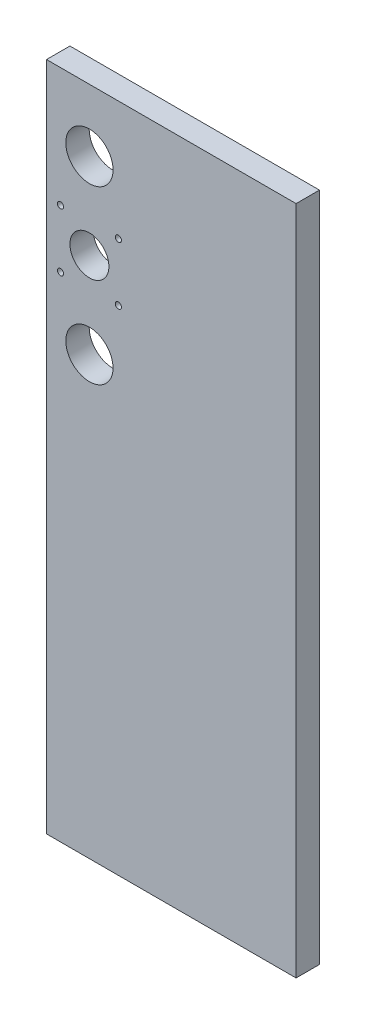
ISO-10303-21;
HEADER;
FILE_DESCRIPTION(('STEP AP214'),'2;1');
FILE_NAME('part.step','',(''),(''),'','','');
FILE_SCHEMA(('AUTOMOTIVE_DESIGN { 1 0 10303 214 1 1 1 1 }'));
ENDSEC;
DATA;
#1=APPLICATION_CONTEXT('core data for automotive mechanical design processes');
#2=APPLICATION_PROTOCOL_DEFINITION('international standard','automotive_design',2000,#1);
#3=PRODUCT_CONTEXT('',#1,'mechanical');
#4=PRODUCT('Part','Part','',(#3));
#5=PRODUCT_RELATED_PRODUCT_CATEGORY('part','',(#4));
#6=PRODUCT_DEFINITION_FORMATION('','',#4);
#7=PRODUCT_DEFINITION_CONTEXT('part definition',#1,'design');
#8=PRODUCT_DEFINITION('design','',#6,#7);
#9=PRODUCT_DEFINITION_SHAPE('','',#8);
#10=(LENGTH_UNIT() NAMED_UNIT(*) SI_UNIT(.MILLI.,.METRE.));
#11=(NAMED_UNIT(*) PLANE_ANGLE_UNIT() SI_UNIT($,.RADIAN.));
#12=(NAMED_UNIT(*) SI_UNIT($,.STERADIAN.) SOLID_ANGLE_UNIT());
#13=UNCERTAINTY_MEASURE_WITH_UNIT(LENGTH_MEASURE(1.E-05),#10,'distance_accuracy_value','');
#14=(GEOMETRIC_REPRESENTATION_CONTEXT(3) GLOBAL_UNCERTAINTY_ASSIGNED_CONTEXT((#13)) GLOBAL_UNIT_ASSIGNED_CONTEXT((#10,
#11,#12)) REPRESENTATION_CONTEXT('',''));
#15=CARTESIAN_POINT('',(0.,0.,0.));
#16=DIRECTION('',(0.,0.,1.));
#17=DIRECTION('',(1.,0.,0.));
#18=AXIS2_PLACEMENT_3D('',#15,#16,#17);
#19=CARTESIAN_POINT('',(0.,0.,19.05));
#20=DIRECTION('',(1.,0.,0.));
#21=DIRECTION('',(0.,0.,-1.));
#22=AXIS2_PLACEMENT_3D('',#19,#20,#21);
#23=PLANE('',#22);
#24=DIRECTION('',(0.,-1.,0.));
#25=VECTOR('',#24,1.);
#26=CARTESIAN_POINT('',(0.,0.,0.));
#27=LINE('',#26,#25);
#28=CARTESIAN_POINT('',(0.,546.1,0.));
#29=VERTEX_POINT('',#28);
#30=CARTESIAN_POINT('',(0.,0.,0.));
#31=VERTEX_POINT('',#30);
#32=EDGE_CURVE('E95',#29,#31,#27,.T.);
#33=ORIENTED_EDGE('',*,*,#32,.T.);
#34=DIRECTION('',(0.,0.,-1.));
#35=VECTOR('',#34,1.);
#36=CARTESIAN_POINT('',(0.,0.,19.05));
#37=LINE('',#36,#35);
#38=CARTESIAN_POINT('',(0.,0.,19.05));
#39=VERTEX_POINT('',#38);
#40=EDGE_CURVE('E11',#39,#31,#37,.T.);
#41=ORIENTED_EDGE('',*,*,#40,.F.);
#42=DIRECTION('',(0.,-1.,0.));
#43=VECTOR('',#42,1.);
#44=CARTESIAN_POINT('',(0.,0.,19.05));
#45=LINE('',#44,#43);
#46=CARTESIAN_POINT('',(0.,546.1,19.05));
#47=VERTEX_POINT('',#46);
#48=EDGE_CURVE('E83',#47,#39,#45,.T.);
#49=ORIENTED_EDGE('',*,*,#48,.F.);
#50=DIRECTION('',(0.,0.,-1.));
#51=VECTOR('',#50,1.);
#52=CARTESIAN_POINT('',(0.,546.1,19.05));
#53=LINE('',#52,#51);
#54=EDGE_CURVE('E91',#47,#29,#53,.T.);
#55=ORIENTED_EDGE('',*,*,#54,.T.);
#56=EDGE_LOOP('',(#33,#41,#49,#55));
#57=FACE_BOUND('',#56,.T.);
#58=ADVANCED_FACE('F32',(#57),#23,.F.);
#59=CARTESIAN_POINT('',(0.,0.,19.05));
#60=DIRECTION('',(0.,1.,0.));
#61=DIRECTION('',(0.,0.,1.));
#62=AXIS2_PLACEMENT_3D('',#59,#60,#61);
#63=PLANE('',#62);
#64=DIRECTION('',(1.,0.,0.));
#65=VECTOR('',#64,1.);
#66=CARTESIAN_POINT('',(0.,0.,0.));
#67=LINE('',#66,#65);
#68=CARTESIAN_POINT('',(203.2,0.,0.));
#69=VERTEX_POINT('',#68);
#70=EDGE_CURVE('E87',#31,#69,#67,.T.);
#71=ORIENTED_EDGE('',*,*,#70,.T.);
#72=DIRECTION('',(0.,0.,-1.));
#73=VECTOR('',#72,1.);
#74=CARTESIAN_POINT('',(203.2,0.,19.05));
#75=LINE('',#74,#73);
#76=CARTESIAN_POINT('',(203.2,0.,19.05));
#77=VERTEX_POINT('',#76);
#78=EDGE_CURVE('E40',#77,#69,#75,.T.);
#79=ORIENTED_EDGE('',*,*,#78,.F.);
#80=DIRECTION('',(1.,0.,0.));
#81=VECTOR('',#80,1.);
#82=CARTESIAN_POINT('',(0.,0.,19.05));
#83=LINE('',#82,#81);
#84=EDGE_CURVE('E78',#39,#77,#83,.T.);
#85=ORIENTED_EDGE('',*,*,#84,.F.);
#86=ORIENTED_EDGE('',*,*,#40,.T.);
#87=EDGE_LOOP('',(#71,#79,#85,#86));
#88=FACE_BOUND('',#87,.T.);
#89=ADVANCED_FACE('F86',(#88),#63,.F.);
#90=CARTESIAN_POINT('',(203.2,0.,19.05));
#91=DIRECTION('',(-1.,0.,0.));
#92=DIRECTION('',(0.,0.,1.));
#93=AXIS2_PLACEMENT_3D('',#90,#91,#92);
#94=PLANE('',#93);
#95=DIRECTION('',(0.,1.,0.));
#96=VECTOR('',#95,1.);
#97=CARTESIAN_POINT('',(203.2,0.,0.));
#98=LINE('',#97,#96);
#99=CARTESIAN_POINT('',(203.2,546.1,0.));
#100=VERTEX_POINT('',#99);
#101=EDGE_CURVE('E65',#69,#100,#98,.T.);
#102=ORIENTED_EDGE('',*,*,#101,.T.);
#103=DIRECTION('',(0.,0.,-1.));
#104=VECTOR('',#103,1.);
#105=CARTESIAN_POINT('',(203.2,546.1,19.05));
#106=LINE('',#105,#104);
#107=CARTESIAN_POINT('',(203.2,546.1,19.05));
#108=VERTEX_POINT('',#107);
#109=EDGE_CURVE('E88',#108,#100,#106,.T.);
#110=ORIENTED_EDGE('',*,*,#109,.F.);
#111=DIRECTION('',(0.,1.,0.));
#112=VECTOR('',#111,1.);
#113=CARTESIAN_POINT('',(203.2,0.,19.05));
#114=LINE('',#113,#112);
#115=EDGE_CURVE('E81',#77,#108,#114,.T.);
#116=ORIENTED_EDGE('',*,*,#115,.F.);
#117=ORIENTED_EDGE('',*,*,#78,.T.);
#118=EDGE_LOOP('',(#102,#110,#116,#117));
#119=FACE_BOUND('',#118,.T.);
#120=ADVANCED_FACE('F89',(#119),#94,.F.);
#121=CARTESIAN_POINT('',(0.,546.1,19.05));
#122=DIRECTION('',(0.,-1.,0.));
#123=DIRECTION('',(0.,0.,-1.));
#124=AXIS2_PLACEMENT_3D('',#121,#122,#123);
#125=PLANE('',#124);
#126=DIRECTION('',(-1.,0.,0.));
#127=VECTOR('',#126,1.);
#128=CARTESIAN_POINT('',(0.,546.1,0.));
#129=LINE('',#128,#127);
#130=EDGE_CURVE('E71',#100,#29,#129,.T.);
#131=ORIENTED_EDGE('',*,*,#130,.T.);
#132=ORIENTED_EDGE('',*,*,#54,.F.);
#133=DIRECTION('',(-1.,0.,0.));
#134=VECTOR('',#133,1.);
#135=CARTESIAN_POINT('',(0.,546.1,19.05));
#136=LINE('',#135,#134);
#137=EDGE_CURVE('E48',#108,#47,#136,.T.);
#138=ORIENTED_EDGE('',*,*,#137,.F.);
#139=ORIENTED_EDGE('',*,*,#109,.T.);
#140=EDGE_LOOP('',(#131,#132,#138,#139));
#141=FACE_BOUND('',#140,.T.);
#142=ADVANCED_FACE('F103',(#141),#125,.F.);
#143=CARTESIAN_POINT('',(0.,546.1,19.05));
#144=DIRECTION('',(0.,0.,-1.));
#145=DIRECTION('',(-1.,0.,0.));
#146=AXIS2_PLACEMENT_3D('',#143,#144,#145);
#147=PLANE('',#146);
#148=CARTESIAN_POINT('',(58.4962,401.8788,19.05));
#149=DIRECTION('',(0.,0.,-1.));
#150=DIRECTION('',(-1.,0.,0.));
#151=AXIS2_PLACEMENT_3D('',#148,#149,#150);
#152=CIRCLE('',#151,2.5);
#153=CARTESIAN_POINT('',(55.9962,401.8788,19.05));
#154=VERTEX_POINT('',#153);
#155=EDGE_CURVE('E144',#154,#154,#152,.F.);
#156=ORIENTED_EDGE('',*,*,#155,.F.);
#157=EDGE_LOOP('',(#156));
#158=FACE_BOUND('',#157,.T.);
#159=CARTESIAN_POINT('',(11.3538,401.8788,19.05));
#160=DIRECTION('',(0.,0.,-1.));
#161=DIRECTION('',(-1.,0.,0.));
#162=AXIS2_PLACEMENT_3D('',#159,#160,#161);
#163=CIRCLE('',#162,2.5);
#164=CARTESIAN_POINT('',(8.8538,401.8788,19.05));
#165=VERTEX_POINT('',#164);
#166=EDGE_CURVE('E138',#165,#165,#163,.F.);
#167=ORIENTED_EDGE('',*,*,#166,.F.);
#168=EDGE_LOOP('',(#167));
#169=FACE_BOUND('',#168,.T.);
#170=CARTESIAN_POINT('',(11.3538,449.0212,19.05));
#171=DIRECTION('',(0.,0.,-1.));
#172=DIRECTION('',(-1.,0.,0.));
#173=AXIS2_PLACEMENT_3D('',#170,#171,#172);
#174=CIRCLE('',#173,2.5);
#175=CARTESIAN_POINT('',(8.8538,449.0212,19.05));
#176=VERTEX_POINT('',#175);
#177=EDGE_CURVE('E132',#176,#176,#174,.F.);
#178=ORIENTED_EDGE('',*,*,#177,.F.);
#179=EDGE_LOOP('',(#178));
#180=FACE_BOUND('',#179,.T.);
#181=CARTESIAN_POINT('',(58.4962,449.0212,19.05));
#182=DIRECTION('',(0.,0.,-1.));
#183=DIRECTION('',(-1.,0.,0.));
#184=AXIS2_PLACEMENT_3D('',#181,#182,#183);
#185=CIRCLE('',#184,2.5);
#186=CARTESIAN_POINT('',(55.9962,449.0212,19.05));
#187=VERTEX_POINT('',#186);
#188=EDGE_CURVE('E126',#187,#187,#185,.F.);
#189=ORIENTED_EDGE('',*,*,#188,.F.);
#190=EDGE_LOOP('',(#189));
#191=FACE_BOUND('',#190,.T.);
#192=CARTESIAN_POINT('',(34.925,425.45,19.05));
#193=DIRECTION('',(0.,0.,-1.));
#194=DIRECTION('',(-1.,0.,0.));
#195=AXIS2_PLACEMENT_3D('',#192,#193,#194);
#196=CIRCLE('',#195,15.875);
#197=CARTESIAN_POINT('',(19.05,425.45,19.05));
#198=VERTEX_POINT('',#197);
#199=EDGE_CURVE('E118',#198,#198,#196,.F.);
#200=ORIENTED_EDGE('',*,*,#199,.F.);
#201=EDGE_LOOP('',(#200));
#202=FACE_BOUND('',#201,.T.);
#203=CARTESIAN_POINT('',(34.9250000000001,355.6,19.05));
#204=DIRECTION('',(0.,0.,-1.));
#205=DIRECTION('',(-1.,0.,0.));
#206=AXIS2_PLACEMENT_3D('',#203,#204,#205);
#207=CIRCLE('',#206,19.2405);
#208=CARTESIAN_POINT('',(15.6845,355.6,19.05));
#209=VERTEX_POINT('',#208);
#210=EDGE_CURVE('E112',#209,#209,#207,.T.);
#211=ORIENTED_EDGE('',*,*,#210,.T.);
#212=EDGE_LOOP('',(#211));
#213=FACE_BOUND('',#212,.T.);
#214=CARTESIAN_POINT('',(34.9250000000001,495.3,19.05));
#215=DIRECTION('',(0.,0.,-1.));
#216=DIRECTION('',(-1.,0.,0.));
#217=AXIS2_PLACEMENT_3D('',#214,#215,#216);
#218=CIRCLE('',#217,19.2405);
#219=CARTESIAN_POINT('',(15.6845,495.3,19.05));
#220=VERTEX_POINT('',#219);
#221=EDGE_CURVE('E98',#220,#220,#218,.T.);
#222=ORIENTED_EDGE('',*,*,#221,.T.);
#223=EDGE_LOOP('',(#222));
#224=FACE_BOUND('',#223,.T.);
#225=ORIENTED_EDGE('',*,*,#48,.T.);
#226=ORIENTED_EDGE('',*,*,#84,.T.);
#227=ORIENTED_EDGE('',*,*,#115,.T.);
#228=ORIENTED_EDGE('',*,*,#137,.T.);
#229=EDGE_LOOP('',(#225,#226,#227,#228));
#230=FACE_BOUND('',#229,.T.);
#231=ADVANCED_FACE('F79',(#158,#169,#180,#191,#202,#213,#224,#230),#147,.F.);
#232=CARTESIAN_POINT('',(0.,546.1,0.));
#233=DIRECTION('',(0.,0.,-1.));
#234=DIRECTION('',(-1.,0.,0.));
#235=AXIS2_PLACEMENT_3D('',#232,#233,#234);
#236=PLANE('',#235);
#237=CARTESIAN_POINT('',(58.4962,401.8788,0.));
#238=DIRECTION('',(0.,0.,-1.));
#239=DIRECTION('',(-1.,0.,0.));
#240=AXIS2_PLACEMENT_3D('',#237,#238,#239);
#241=CIRCLE('',#240,2.5);
#242=CARTESIAN_POINT('',(55.9962,401.8788,0.));
#243=VERTEX_POINT('',#242);
#244=EDGE_CURVE('E147',#243,#243,#241,.T.);
#245=ORIENTED_EDGE('',*,*,#244,.F.);
#246=EDGE_LOOP('',(#245));
#247=FACE_BOUND('',#246,.T.);
#248=CARTESIAN_POINT('',(11.3538,401.8788,0.));
#249=DIRECTION('',(0.,0.,-1.));
#250=DIRECTION('',(-1.,0.,0.));
#251=AXIS2_PLACEMENT_3D('',#248,#249,#250);
#252=CIRCLE('',#251,2.5);
#253=CARTESIAN_POINT('',(8.8538,401.8788,0.));
#254=VERTEX_POINT('',#253);
#255=EDGE_CURVE('E141',#254,#254,#252,.T.);
#256=ORIENTED_EDGE('',*,*,#255,.F.);
#257=EDGE_LOOP('',(#256));
#258=FACE_BOUND('',#257,.T.);
#259=CARTESIAN_POINT('',(11.3538,449.0212,0.));
#260=DIRECTION('',(0.,0.,-1.));
#261=DIRECTION('',(-1.,0.,0.));
#262=AXIS2_PLACEMENT_3D('',#259,#260,#261);
#263=CIRCLE('',#262,2.5);
#264=CARTESIAN_POINT('',(8.8538,449.0212,0.));
#265=VERTEX_POINT('',#264);
#266=EDGE_CURVE('E135',#265,#265,#263,.T.);
#267=ORIENTED_EDGE('',*,*,#266,.F.);
#268=EDGE_LOOP('',(#267));
#269=FACE_BOUND('',#268,.T.);
#270=CARTESIAN_POINT('',(58.4962,449.0212,0.));
#271=DIRECTION('',(0.,0.,-1.));
#272=DIRECTION('',(-1.,0.,0.));
#273=AXIS2_PLACEMENT_3D('',#270,#271,#272);
#274=CIRCLE('',#273,2.5);
#275=CARTESIAN_POINT('',(55.9962,449.0212,0.));
#276=VERTEX_POINT('',#275);
#277=EDGE_CURVE('E129',#276,#276,#274,.T.);
#278=ORIENTED_EDGE('',*,*,#277,.F.);
#279=EDGE_LOOP('',(#278));
#280=FACE_BOUND('',#279,.T.);
#281=CARTESIAN_POINT('',(34.925,425.45,0.));
#282=DIRECTION('',(0.,0.,-1.));
#283=DIRECTION('',(-1.,0.,0.));
#284=AXIS2_PLACEMENT_3D('',#281,#282,#283);
#285=CIRCLE('',#284,15.875);
#286=CARTESIAN_POINT('',(19.05,425.45,0.));
#287=VERTEX_POINT('',#286);
#288=EDGE_CURVE('E123',#287,#287,#285,.T.);
#289=ORIENTED_EDGE('',*,*,#288,.F.);
#290=EDGE_LOOP('',(#289));
#291=FACE_BOUND('',#290,.T.);
#292=CARTESIAN_POINT('',(34.9250000000001,355.6,0.));
#293=DIRECTION('',(0.,0.,-1.));
#294=DIRECTION('',(-1.,0.,0.));
#295=AXIS2_PLACEMENT_3D('',#292,#293,#294);
#296=CIRCLE('',#295,19.2405);
#297=CARTESIAN_POINT('',(15.6845,355.6,0.));
#298=VERTEX_POINT('',#297);
#299=EDGE_CURVE('E115',#298,#298,#296,.T.);
#300=ORIENTED_EDGE('',*,*,#299,.F.);
#301=EDGE_LOOP('',(#300));
#302=FACE_BOUND('',#301,.T.);
#303=CARTESIAN_POINT('',(34.9250000000001,495.3,0.));
#304=DIRECTION('',(0.,0.,-1.));
#305=DIRECTION('',(-1.,0.,0.));
#306=AXIS2_PLACEMENT_3D('',#303,#304,#305);
#307=CIRCLE('',#306,19.2405);
#308=CARTESIAN_POINT('',(15.6845,495.3,0.));
#309=VERTEX_POINT('',#308);
#310=EDGE_CURVE('E109',#309,#309,#307,.T.);
#311=ORIENTED_EDGE('',*,*,#310,.F.);
#312=EDGE_LOOP('',(#311));
#313=FACE_BOUND('',#312,.T.);
#314=ORIENTED_EDGE('',*,*,#32,.F.);
#315=ORIENTED_EDGE('',*,*,#130,.F.);
#316=ORIENTED_EDGE('',*,*,#101,.F.);
#317=ORIENTED_EDGE('',*,*,#70,.F.);
#318=EDGE_LOOP('',(#314,#315,#316,#317));
#319=FACE_BOUND('',#318,.T.);
#320=ADVANCED_FACE('F106',(#247,#258,#269,#280,#291,#302,#313,#319),#236,.T.);
#321=CARTESIAN_POINT('',(34.9250000000001,495.3,19.05));
#322=DIRECTION('',(0.,0.,-1.));
#323=DIRECTION('',(-1.,0.,0.));
#324=AXIS2_PLACEMENT_3D('',#321,#322,#323);
#325=CYLINDRICAL_SURFACE('',#324,19.2405);
#326=CARTESIAN_POINT('',(15.6845,495.3,19.05));
#327=CARTESIAN_POINT('',(15.6845,495.3,18.8515625));
#328=CARTESIAN_POINT('',(15.6845,495.3,18.653125));
#329=CARTESIAN_POINT('',(15.6845,495.3,18.25625));
#330=CARTESIAN_POINT('',(15.6845,495.3,18.0578125));
#331=CARTESIAN_POINT('',(15.6845,495.3,17.6609375));
#332=CARTESIAN_POINT('',(15.6845,495.3,17.4625));
#333=CARTESIAN_POINT('',(15.6845,495.3,17.065625));
#334=CARTESIAN_POINT('',(15.6845,495.3,16.8671875));
#335=CARTESIAN_POINT('',(15.6845,495.3,16.4703125));
#336=CARTESIAN_POINT('',(15.6845,495.3,16.271875));
#337=CARTESIAN_POINT('',(15.6845,495.3,15.875));
#338=CARTESIAN_POINT('',(15.6845,495.3,15.6765625));
#339=CARTESIAN_POINT('',(15.6845,495.3,15.2796875));
#340=CARTESIAN_POINT('',(15.6845,495.3,15.08125));
#341=CARTESIAN_POINT('',(15.6845,495.3,14.684375));
#342=CARTESIAN_POINT('',(15.6845,495.3,14.4859375));
#343=CARTESIAN_POINT('',(15.6845,495.3,14.0890625));
#344=CARTESIAN_POINT('',(15.6845,495.3,13.890625));
#345=CARTESIAN_POINT('',(15.6845,495.3,13.49375));
#346=CARTESIAN_POINT('',(15.6845,495.3,13.2953125));
#347=CARTESIAN_POINT('',(15.6845,495.3,12.8984375));
#348=CARTESIAN_POINT('',(15.6845,495.3,12.7));
#349=CARTESIAN_POINT('',(15.6845,495.3,12.303125));
#350=CARTESIAN_POINT('',(15.6845,495.3,12.1046875));
#351=CARTESIAN_POINT('',(15.6845,495.3,11.7078125));
#352=CARTESIAN_POINT('',(15.6845,495.3,11.509375));
#353=CARTESIAN_POINT('',(15.6845,495.3,11.1125));
#354=CARTESIAN_POINT('',(15.6845,495.3,10.9140625));
#355=CARTESIAN_POINT('',(15.6845,495.3,10.5171875));
#356=CARTESIAN_POINT('',(15.6845,495.3,10.31875));
#357=CARTESIAN_POINT('',(15.6845,495.3,9.921875));
#358=CARTESIAN_POINT('',(15.6845,495.3,9.7234375));
#359=CARTESIAN_POINT('',(15.6845,495.3,9.3265625));
#360=CARTESIAN_POINT('',(15.6845,495.3,9.128125));
#361=CARTESIAN_POINT('',(15.6845,495.3,8.73125));
#362=CARTESIAN_POINT('',(15.6845,495.3,8.5328125));
#363=CARTESIAN_POINT('',(15.6845,495.3,8.1359375));
#364=CARTESIAN_POINT('',(15.6845,495.3,7.9375));
#365=CARTESIAN_POINT('',(15.6845,495.3,7.540625));
#366=CARTESIAN_POINT('',(15.6845,495.3,7.3421875));
#367=CARTESIAN_POINT('',(15.6845,495.3,6.9453125));
#368=CARTESIAN_POINT('',(15.6845,495.3,6.746875));
#369=CARTESIAN_POINT('',(15.6845,495.3,6.35));
#370=CARTESIAN_POINT('',(15.6845,495.3,6.1515625));
#371=CARTESIAN_POINT('',(15.6845,495.3,5.7546875));
#372=CARTESIAN_POINT('',(15.6845,495.3,5.55625));
#373=CARTESIAN_POINT('',(15.6845,495.3,5.159375));
#374=CARTESIAN_POINT('',(15.6845,495.3,4.9609375));
#375=CARTESIAN_POINT('',(15.6845,495.3,4.5640625));
#376=CARTESIAN_POINT('',(15.6845,495.3,4.365625));
#377=CARTESIAN_POINT('',(15.6845,495.3,3.96875));
#378=CARTESIAN_POINT('',(15.6845,495.3,3.7703125));
#379=CARTESIAN_POINT('',(15.6845,495.3,3.3734375));
#380=CARTESIAN_POINT('',(15.6845,495.3,3.175));
#381=CARTESIAN_POINT('',(15.6845,495.3,2.778125));
#382=CARTESIAN_POINT('',(15.6845,495.3,2.5796875));
#383=CARTESIAN_POINT('',(15.6845,495.3,2.1828125));
#384=CARTESIAN_POINT('',(15.6845,495.3,1.984375));
#385=CARTESIAN_POINT('',(15.6845,495.3,1.5875));
#386=CARTESIAN_POINT('',(15.6845,495.3,1.3890625));
#387=CARTESIAN_POINT('',(15.6845,495.3,0.992187500000001));
#388=CARTESIAN_POINT('',(15.6845,495.3,0.793750000000001));
#389=CARTESIAN_POINT('',(15.6845,495.3,0.396875));
#390=CARTESIAN_POINT('',(15.6845,495.3,0.1984375));
#391=CARTESIAN_POINT('',(15.6845,495.3,0.));
#392=B_SPLINE_CURVE_WITH_KNOTS('',3,(#326,#327,#328,#329,#330,#331,#332,#333,#334,#335,#336,
#337,#338,#339,#340,#341,#342,#343,#344,#345,#346,#347,#348,#349,#350,#351,#352,#353,#354,#355,
#356,#357,#358,#359,#360,#361,#362,#363,#364,#365,#366,#367,#368,#369,#370,#371,#372,#373,#374,
#375,#376,#377,#378,#379,#380,#381,#382,#383,#384,#385,#386,#387,#388,#389,#390,#391),
.UNSPECIFIED.,.F.,.F.,(4,2,2,2,2,2,2,2,2,2,2,2,2,2,2,2,2,2,2,2,2,2,2,2,2,2,2,2,2,2,2,2,4),(0.,
0.595312499999997,1.190625,1.7859375,2.38125,2.9765625,3.571875,4.1671875,4.7625,5.3578125,
5.953125,6.5484375,7.14375,7.7390625,8.334375,8.9296875,9.525,10.1203125,10.715625,11.3109375,
11.90625,12.5015625,13.096875,13.6921875,14.2875,14.8828125,15.478125,16.0734375,16.66875,
17.2640625,17.859375,18.4546875,19.05),.UNSPECIFIED.);
#393=EDGE_CURVE('BSEAM156',#220,#309,#392,.T.);
#394=ORIENTED_EDGE('',*,*,#221,.F.);
#395=ORIENTED_EDGE('',*,*,#310,.T.);
#396=ORIENTED_EDGE('',*,*,#393,.T.);
#397=ORIENTED_EDGE('',*,*,#393,.F.);
#398=EDGE_LOOP('',(#394,#396,#395,#397));
#399=FACE_BOUND('',#398,.T.);
#400=ADVANCED_FACE('F156',(#399),#325,.F.);
#401=CARTESIAN_POINT('',(34.9250000000001,355.6,19.05));
#402=DIRECTION('',(0.,0.,-1.));
#403=DIRECTION('',(-1.,0.,0.));
#404=AXIS2_PLACEMENT_3D('',#401,#402,#403);
#405=CYLINDRICAL_SURFACE('',#404,19.2405);
#406=CARTESIAN_POINT('',(15.6845,355.6,19.05));
#407=CARTESIAN_POINT('',(15.6845,355.6,18.8515625));
#408=CARTESIAN_POINT('',(15.6845,355.6,18.653125));
#409=CARTESIAN_POINT('',(15.6845,355.6,18.25625));
#410=CARTESIAN_POINT('',(15.6845,355.6,18.0578125));
#411=CARTESIAN_POINT('',(15.6845,355.6,17.6609375));
#412=CARTESIAN_POINT('',(15.6845,355.6,17.4625));
#413=CARTESIAN_POINT('',(15.6845,355.6,17.065625));
#414=CARTESIAN_POINT('',(15.6845,355.6,16.8671875));
#415=CARTESIAN_POINT('',(15.6845,355.6,16.4703125));
#416=CARTESIAN_POINT('',(15.6845,355.6,16.271875));
#417=CARTESIAN_POINT('',(15.6845,355.6,15.875));
#418=CARTESIAN_POINT('',(15.6845,355.6,15.6765625));
#419=CARTESIAN_POINT('',(15.6845,355.6,15.2796875));
#420=CARTESIAN_POINT('',(15.6845,355.6,15.08125));
#421=CARTESIAN_POINT('',(15.6845,355.6,14.684375));
#422=CARTESIAN_POINT('',(15.6845,355.6,14.4859375));
#423=CARTESIAN_POINT('',(15.6845,355.6,14.0890625));
#424=CARTESIAN_POINT('',(15.6845,355.6,13.890625));
#425=CARTESIAN_POINT('',(15.6845,355.6,13.49375));
#426=CARTESIAN_POINT('',(15.6845,355.6,13.2953125));
#427=CARTESIAN_POINT('',(15.6845,355.6,12.8984375));
#428=CARTESIAN_POINT('',(15.6845,355.6,12.7));
#429=CARTESIAN_POINT('',(15.6845,355.6,12.303125));
#430=CARTESIAN_POINT('',(15.6845,355.6,12.1046875));
#431=CARTESIAN_POINT('',(15.6845,355.6,11.7078125));
#432=CARTESIAN_POINT('',(15.6845,355.6,11.509375));
#433=CARTESIAN_POINT('',(15.6845,355.6,11.1125));
#434=CARTESIAN_POINT('',(15.6845,355.6,10.9140625));
#435=CARTESIAN_POINT('',(15.6845,355.6,10.5171875));
#436=CARTESIAN_POINT('',(15.6845,355.6,10.31875));
#437=CARTESIAN_POINT('',(15.6845,355.6,9.921875));
#438=CARTESIAN_POINT('',(15.6845,355.6,9.7234375));
#439=CARTESIAN_POINT('',(15.6845,355.6,9.3265625));
#440=CARTESIAN_POINT('',(15.6845,355.6,9.128125));
#441=CARTESIAN_POINT('',(15.6845,355.6,8.73125));
#442=CARTESIAN_POINT('',(15.6845,355.6,8.5328125));
#443=CARTESIAN_POINT('',(15.6845,355.6,8.1359375));
#444=CARTESIAN_POINT('',(15.6845,355.6,7.9375));
#445=CARTESIAN_POINT('',(15.6845,355.6,7.540625));
#446=CARTESIAN_POINT('',(15.6845,355.6,7.3421875));
#447=CARTESIAN_POINT('',(15.6845,355.6,6.9453125));
#448=CARTESIAN_POINT('',(15.6845,355.6,6.746875));
#449=CARTESIAN_POINT('',(15.6845,355.6,6.35));
#450=CARTESIAN_POINT('',(15.6845,355.6,6.1515625));
#451=CARTESIAN_POINT('',(15.6845,355.6,5.7546875));
#452=CARTESIAN_POINT('',(15.6845,355.6,5.55625));
#453=CARTESIAN_POINT('',(15.6845,355.6,5.159375));
#454=CARTESIAN_POINT('',(15.6845,355.6,4.9609375));
#455=CARTESIAN_POINT('',(15.6845,355.6,4.5640625));
#456=CARTESIAN_POINT('',(15.6845,355.6,4.365625));
#457=CARTESIAN_POINT('',(15.6845,355.6,3.96875));
#458=CARTESIAN_POINT('',(15.6845,355.6,3.7703125));
#459=CARTESIAN_POINT('',(15.6845,355.6,3.3734375));
#460=CARTESIAN_POINT('',(15.6845,355.6,3.175));
#461=CARTESIAN_POINT('',(15.6845,355.6,2.778125));
#462=CARTESIAN_POINT('',(15.6845,355.6,2.5796875));
#463=CARTESIAN_POINT('',(15.6845,355.6,2.1828125));
#464=CARTESIAN_POINT('',(15.6845,355.6,1.984375));
#465=CARTESIAN_POINT('',(15.6845,355.6,1.5875));
#466=CARTESIAN_POINT('',(15.6845,355.6,1.3890625));
#467=CARTESIAN_POINT('',(15.6845,355.6,0.992187500000001));
#468=CARTESIAN_POINT('',(15.6845,355.6,0.793750000000001));
#469=CARTESIAN_POINT('',(15.6845,355.6,0.396875));
#470=CARTESIAN_POINT('',(15.6845,355.6,0.1984375));
#471=CARTESIAN_POINT('',(15.6845,355.6,0.));
#472=B_SPLINE_CURVE_WITH_KNOTS('',3,(#406,#407,#408,#409,#410,#411,#412,#413,#414,#415,#416,
#417,#418,#419,#420,#421,#422,#423,#424,#425,#426,#427,#428,#429,#430,#431,#432,#433,#434,#435,
#436,#437,#438,#439,#440,#441,#442,#443,#444,#445,#446,#447,#448,#449,#450,#451,#452,#453,#454,
#455,#456,#457,#458,#459,#460,#461,#462,#463,#464,#465,#466,#467,#468,#469,#470,#471),
.UNSPECIFIED.,.F.,.F.,(4,2,2,2,2,2,2,2,2,2,2,2,2,2,2,2,2,2,2,2,2,2,2,2,2,2,2,2,2,2,2,2,4),(0.,
0.595312499999997,1.190625,1.7859375,2.38125,2.9765625,3.571875,4.1671875,4.7625,5.3578125,
5.953125,6.5484375,7.14375,7.7390625,8.334375,8.9296875,9.525,10.1203125,10.715625,11.3109375,
11.90625,12.5015625,13.096875,13.6921875,14.2875,14.8828125,15.478125,16.0734375,16.66875,
17.2640625,17.859375,18.4546875,19.05),.UNSPECIFIED.);
#473=EDGE_CURVE('BSEAM171',#209,#298,#472,.T.);
#474=ORIENTED_EDGE('',*,*,#210,.F.);
#475=ORIENTED_EDGE('',*,*,#299,.T.);
#476=ORIENTED_EDGE('',*,*,#473,.T.);
#477=ORIENTED_EDGE('',*,*,#473,.F.);
#478=EDGE_LOOP('',(#474,#476,#475,#477));
#479=FACE_BOUND('',#478,.T.);
#480=ADVANCED_FACE('F171',(#479),#405,.F.);
#481=CARTESIAN_POINT('',(34.925,425.45,19.051));
#482=DIRECTION('',(0.,0.,-1.));
#483=DIRECTION('',(-1.,0.,0.));
#484=AXIS2_PLACEMENT_3D('',#481,#482,#483);
#485=CYLINDRICAL_SURFACE('',#484,15.875);
#486=ORIENTED_EDGE('',*,*,#288,.T.);
#487=EDGE_LOOP('',(#486));
#488=FACE_BOUND('',#487,.T.);
#489=ORIENTED_EDGE('',*,*,#199,.T.);
#490=EDGE_LOOP('',(#489));
#491=FACE_BOUND('',#490,.T.);
#492=ADVANCED_FACE('F177',(#488,#491),#485,.F.);
#493=CARTESIAN_POINT('',(58.4962,449.0212,19.051));
#494=DIRECTION('',(0.,0.,-1.));
#495=DIRECTION('',(-1.,0.,0.));
#496=AXIS2_PLACEMENT_3D('',#493,#494,#495);
#497=CYLINDRICAL_SURFACE('',#496,2.5);
#498=ORIENTED_EDGE('',*,*,#277,.T.);
#499=EDGE_LOOP('',(#498));
#500=FACE_BOUND('',#499,.T.);
#501=ORIENTED_EDGE('',*,*,#188,.T.);
#502=EDGE_LOOP('',(#501));
#503=FACE_BOUND('',#502,.T.);
#504=ADVANCED_FACE('F211',(#500,#503),#497,.F.);
#505=CARTESIAN_POINT('',(11.3538,449.0212,19.051));
#506=DIRECTION('',(0.,0.,-1.));
#507=DIRECTION('',(-1.,0.,0.));
#508=AXIS2_PLACEMENT_3D('',#505,#506,#507);
#509=CYLINDRICAL_SURFACE('',#508,2.5);
#510=ORIENTED_EDGE('',*,*,#266,.T.);
#511=EDGE_LOOP('',(#510));
#512=FACE_BOUND('',#511,.T.);
#513=ORIENTED_EDGE('',*,*,#177,.T.);
#514=EDGE_LOOP('',(#513));
#515=FACE_BOUND('',#514,.T.);
#516=ADVANCED_FACE('F217',(#512,#515),#509,.F.);
#517=CARTESIAN_POINT('',(11.3538,401.8788,19.051));
#518=DIRECTION('',(0.,0.,-1.));
#519=DIRECTION('',(-1.,0.,0.));
#520=AXIS2_PLACEMENT_3D('',#517,#518,#519);
#521=CYLINDRICAL_SURFACE('',#520,2.5);
#522=ORIENTED_EDGE('',*,*,#255,.T.);
#523=EDGE_LOOP('',(#522));
#524=FACE_BOUND('',#523,.T.);
#525=ORIENTED_EDGE('',*,*,#166,.T.);
#526=EDGE_LOOP('',(#525));
#527=FACE_BOUND('',#526,.T.);
#528=ADVANCED_FACE('F223',(#524,#527),#521,.F.);
#529=CARTESIAN_POINT('',(58.4962,401.8788,19.051));
#530=DIRECTION('',(0.,0.,-1.));
#531=DIRECTION('',(-1.,0.,0.));
#532=AXIS2_PLACEMENT_3D('',#529,#530,#531);
#533=CYLINDRICAL_SURFACE('',#532,2.5);
#534=ORIENTED_EDGE('',*,*,#244,.T.);
#535=EDGE_LOOP('',(#534));
#536=FACE_BOUND('',#535,.T.);
#537=ORIENTED_EDGE('',*,*,#155,.T.);
#538=EDGE_LOOP('',(#537));
#539=FACE_BOUND('',#538,.T.);
#540=ADVANCED_FACE('F151',(#536,#539),#533,.F.);
#541=CLOSED_SHELL('',(#58,#89,#120,#142,#231,#320,#400,#480,#492,#504,#516,#528,#540));
#542=MANIFOLD_SOLID_BREP('B2',#541);
#543=ADVANCED_BREP_SHAPE_REPRESENTATION('',(#18,#542),#14);
#544=SHAPE_DEFINITION_REPRESENTATION(#9,#543);
ENDSEC;
END-ISO-10303-21;
